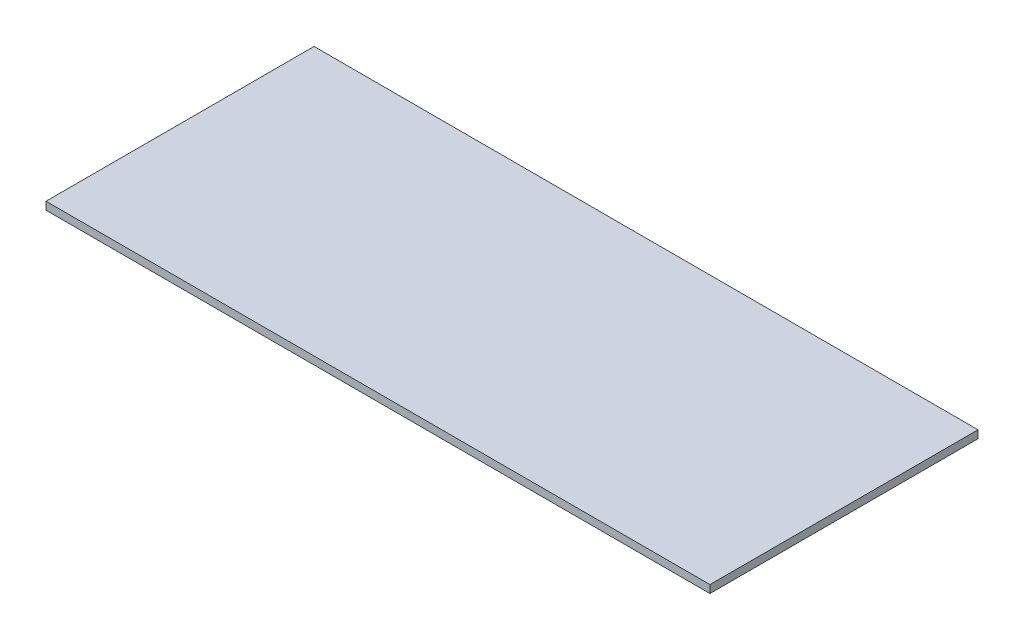
ISO-10303-21;
HEADER;
FILE_DESCRIPTION(('STEP AP214'),'2;1');
FILE_NAME('part.step','',(''),(''),'','','');
FILE_SCHEMA(('AUTOMOTIVE_DESIGN { 1 0 10303 214 1 1 1 1 }'));
ENDSEC;
DATA;
#1=APPLICATION_CONTEXT('core data for automotive mechanical design processes');
#2=APPLICATION_PROTOCOL_DEFINITION('international standard','automotive_design',2000,#1);
#3=PRODUCT_CONTEXT('',#1,'mechanical');
#4=PRODUCT('Part','Part','',(#3));
#5=PRODUCT_RELATED_PRODUCT_CATEGORY('part','',(#4));
#6=PRODUCT_DEFINITION_FORMATION('','',#4);
#7=PRODUCT_DEFINITION_CONTEXT('part definition',#1,'design');
#8=PRODUCT_DEFINITION('design','',#6,#7);
#9=PRODUCT_DEFINITION_SHAPE('','',#8);
#10=(LENGTH_UNIT() NAMED_UNIT(*) SI_UNIT(.MILLI.,.METRE.));
#11=(NAMED_UNIT(*) PLANE_ANGLE_UNIT() SI_UNIT($,.RADIAN.));
#12=(NAMED_UNIT(*) SI_UNIT($,.STERADIAN.) SOLID_ANGLE_UNIT());
#13=UNCERTAINTY_MEASURE_WITH_UNIT(LENGTH_MEASURE(1.E-05),#10,'distance_accuracy_value','');
#14=(GEOMETRIC_REPRESENTATION_CONTEXT(3) GLOBAL_UNCERTAINTY_ASSIGNED_CONTEXT((#13)) GLOBAL_UNIT_ASSIGNED_CONTEXT((#10,
#11,#12)) REPRESENTATION_CONTEXT('',''));
#15=CARTESIAN_POINT('',(0.,0.,0.));
#16=DIRECTION('',(0.,0.,1.));
#17=DIRECTION('',(1.,0.,0.));
#18=AXIS2_PLACEMENT_3D('',#15,#16,#17);
#19=CARTESIAN_POINT('',(0.,4.7625,-164.084));
#20=DIRECTION('',(0.,0.,-1.));
#21=DIRECTION('',(-1.,0.,0.));
#22=AXIS2_PLACEMENT_3D('',#19,#20,#21);
#23=PLANE('',#22);
#24=DIRECTION('',(1.,0.,0.));
#25=VECTOR('',#24,1.);
#26=CARTESIAN_POINT('',(0.,0.,-164.084));
#27=LINE('',#26,#25);
#28=CARTESIAN_POINT('',(0.,0.,-164.084));
#29=VERTEX_POINT('',#28);
#30=CARTESIAN_POINT('',(406.4,0.,-164.084));
#31=VERTEX_POINT('',#30);
#32=EDGE_CURVE('E100',#29,#31,#27,.T.);
#33=ORIENTED_EDGE('',*,*,#32,.F.);
#34=DIRECTION('',(0.,-1.,0.));
#35=VECTOR('',#34,1.);
#36=CARTESIAN_POINT('',(0.,4.7625,-164.084));
#37=LINE('',#36,#35);
#38=CARTESIAN_POINT('',(0.,4.7625,-164.084));
#39=VERTEX_POINT('',#38);
#40=EDGE_CURVE('E11',#39,#29,#37,.T.);
#41=ORIENTED_EDGE('',*,*,#40,.F.);
#42=DIRECTION('',(1.,0.,0.));
#43=VECTOR('',#42,1.);
#44=CARTESIAN_POINT('',(0.,4.7625,-164.084));
#45=LINE('',#44,#43);
#46=CARTESIAN_POINT('',(406.4,4.7625,-164.084));
#47=VERTEX_POINT('',#46);
#48=EDGE_CURVE('E94',#39,#47,#45,.T.);
#49=ORIENTED_EDGE('',*,*,#48,.T.);
#50=DIRECTION('',(0.,-1.,0.));
#51=VECTOR('',#50,1.);
#52=CARTESIAN_POINT('',(406.4,4.7625,-164.084));
#53=LINE('',#52,#51);
#54=EDGE_CURVE('E39',#47,#31,#53,.T.);
#55=ORIENTED_EDGE('',*,*,#54,.T.);
#56=EDGE_LOOP('',(#33,#41,#49,#55));
#57=FACE_BOUND('',#56,.T.);
#58=ADVANCED_FACE('F36',(#57),#23,.T.);
#59=CARTESIAN_POINT('',(0.,4.7625,0.));
#60=DIRECTION('',(-1.,0.,0.));
#61=DIRECTION('',(0.,0.,1.));
#62=AXIS2_PLACEMENT_3D('',#59,#60,#61);
#63=PLANE('',#62);
#64=DIRECTION('',(0.,0.,-1.));
#65=VECTOR('',#64,1.);
#66=CARTESIAN_POINT('',(0.,0.,0.));
#67=LINE('',#66,#65);
#68=CARTESIAN_POINT('',(0.,0.,0.));
#69=VERTEX_POINT('',#68);
#70=EDGE_CURVE('E96',#69,#29,#67,.T.);
#71=ORIENTED_EDGE('',*,*,#70,.F.);
#72=DIRECTION('',(0.,-1.,0.));
#73=VECTOR('',#72,1.);
#74=CARTESIAN_POINT('',(0.,4.7625,0.));
#75=LINE('',#74,#73);
#76=CARTESIAN_POINT('',(0.,4.7625,0.));
#77=VERTEX_POINT('',#76);
#78=EDGE_CURVE('E45',#77,#69,#75,.T.);
#79=ORIENTED_EDGE('',*,*,#78,.F.);
#80=DIRECTION('',(0.,0.,-1.));
#81=VECTOR('',#80,1.);
#82=CARTESIAN_POINT('',(0.,4.7625,0.));
#83=LINE('',#82,#81);
#84=EDGE_CURVE('E84',#77,#39,#83,.T.);
#85=ORIENTED_EDGE('',*,*,#84,.T.);
#86=ORIENTED_EDGE('',*,*,#40,.T.);
#87=EDGE_LOOP('',(#71,#79,#85,#86));
#88=FACE_BOUND('',#87,.T.);
#89=ADVANCED_FACE('F110',(#88),#63,.T.);
#90=CARTESIAN_POINT('',(0.,4.7625,0.));
#91=DIRECTION('',(0.,0.,-1.));
#92=DIRECTION('',(-1.,0.,0.));
#93=AXIS2_PLACEMENT_3D('',#90,#91,#92);
#94=PLANE('',#93);
#95=DIRECTION('',(1.,0.,0.));
#96=VECTOR('',#95,1.);
#97=CARTESIAN_POINT('',(0.,0.,0.));
#98=LINE('',#97,#96);
#99=CARTESIAN_POINT('',(406.4,0.,0.));
#100=VERTEX_POINT('',#99);
#101=EDGE_CURVE('E89',#69,#100,#98,.T.);
#102=ORIENTED_EDGE('',*,*,#101,.T.);
#103=DIRECTION('',(0.,-1.,0.));
#104=VECTOR('',#103,1.);
#105=CARTESIAN_POINT('',(406.4,4.7625,0.));
#106=LINE('',#105,#104);
#107=CARTESIAN_POINT('',(406.4,4.7625,0.));
#108=VERTEX_POINT('',#107);
#109=EDGE_CURVE('E87',#108,#100,#106,.T.);
#110=ORIENTED_EDGE('',*,*,#109,.F.);
#111=DIRECTION('',(1.,0.,0.));
#112=VECTOR('',#111,1.);
#113=CARTESIAN_POINT('',(0.,4.7625,0.));
#114=LINE('',#113,#112);
#115=EDGE_CURVE('E81',#77,#108,#114,.T.);
#116=ORIENTED_EDGE('',*,*,#115,.F.);
#117=ORIENTED_EDGE('',*,*,#78,.T.);
#118=EDGE_LOOP('',(#102,#110,#116,#117));
#119=FACE_BOUND('',#118,.T.);
#120=ADVANCED_FACE('F88',(#119),#94,.F.);
#121=CARTESIAN_POINT('',(406.4,4.7625,0.));
#122=DIRECTION('',(-1.,0.,0.));
#123=DIRECTION('',(0.,0.,1.));
#124=AXIS2_PLACEMENT_3D('',#121,#122,#123);
#125=PLANE('',#124);
#126=DIRECTION('',(0.,0.,-1.));
#127=VECTOR('',#126,1.);
#128=CARTESIAN_POINT('',(406.4,0.,0.));
#129=LINE('',#128,#127);
#130=EDGE_CURVE('E103',#100,#31,#129,.T.);
#131=ORIENTED_EDGE('',*,*,#130,.T.);
#132=ORIENTED_EDGE('',*,*,#54,.F.);
#133=DIRECTION('',(0.,0.,-1.));
#134=VECTOR('',#133,1.);
#135=CARTESIAN_POINT('',(406.4,4.7625,0.));
#136=LINE('',#135,#134);
#137=EDGE_CURVE('E78',#108,#47,#136,.T.);
#138=ORIENTED_EDGE('',*,*,#137,.F.);
#139=ORIENTED_EDGE('',*,*,#109,.T.);
#140=EDGE_LOOP('',(#131,#132,#138,#139));
#141=FACE_BOUND('',#140,.T.);
#142=ADVANCED_FACE('F93',(#141),#125,.F.);
#143=CARTESIAN_POINT('',(0.,4.7625,0.));
#144=DIRECTION('',(0.,1.,0.));
#145=DIRECTION('',(0.,0.,1.));
#146=AXIS2_PLACEMENT_3D('',#143,#144,#145);
#147=PLANE('',#146);
#148=ORIENTED_EDGE('',*,*,#48,.F.);
#149=ORIENTED_EDGE('',*,*,#84,.F.);
#150=ORIENTED_EDGE('',*,*,#115,.T.);
#151=ORIENTED_EDGE('',*,*,#137,.T.);
#152=EDGE_LOOP('',(#148,#149,#150,#151));
#153=FACE_BOUND('',#152,.T.);
#154=ADVANCED_FACE('F83',(#153),#147,.T.);
#155=CARTESIAN_POINT('',(0.,0.,0.));
#156=DIRECTION('',(0.,1.,0.));
#157=DIRECTION('',(0.,0.,1.));
#158=AXIS2_PLACEMENT_3D('',#155,#156,#157);
#159=PLANE('',#158);
#160=ORIENTED_EDGE('',*,*,#32,.T.);
#161=ORIENTED_EDGE('',*,*,#130,.F.);
#162=ORIENTED_EDGE('',*,*,#101,.F.);
#163=ORIENTED_EDGE('',*,*,#70,.T.);
#164=EDGE_LOOP('',(#160,#161,#162,#163));
#165=FACE_BOUND('',#164,.T.);
#166=ADVANCED_FACE('F109',(#165),#159,.F.);
#167=CLOSED_SHELL('',(#58,#89,#120,#142,#154,#166));
#168=MANIFOLD_SOLID_BREP('B2',#167);
#169=ADVANCED_BREP_SHAPE_REPRESENTATION('',(#18,#168),#14);
#170=SHAPE_DEFINITION_REPRESENTATION(#9,#169);
ENDSEC;
END-ISO-10303-21;
